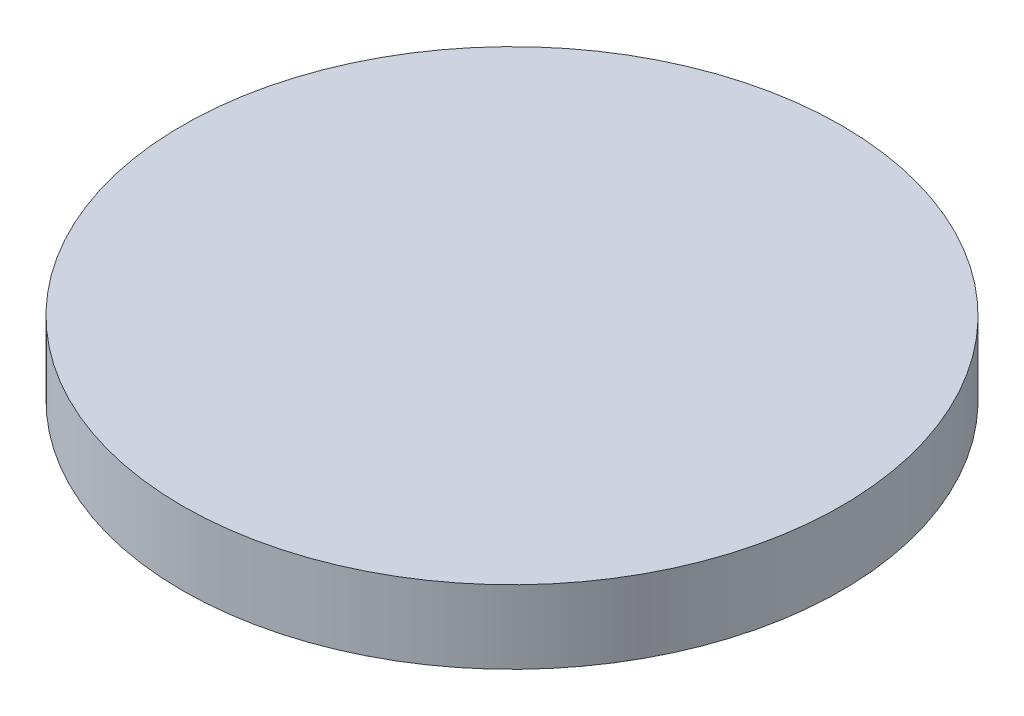
ISO-10303-21;
HEADER;
FILE_DESCRIPTION(('STEP AP214'),'2;1');
FILE_NAME('part.step','',(''),(''),'','','');
FILE_SCHEMA(('AUTOMOTIVE_DESIGN { 1 0 10303 214 1 1 1 1 }'));
ENDSEC;
DATA;
#1=APPLICATION_CONTEXT('core data for automotive mechanical design processes');
#2=APPLICATION_PROTOCOL_DEFINITION('international standard','automotive_design',2000,#1);
#3=PRODUCT_CONTEXT('',#1,'mechanical');
#4=PRODUCT('Part','Part','',(#3));
#5=PRODUCT_RELATED_PRODUCT_CATEGORY('part','',(#4));
#6=PRODUCT_DEFINITION_FORMATION('','',#4);
#7=PRODUCT_DEFINITION_CONTEXT('part definition',#1,'design');
#8=PRODUCT_DEFINITION('design','',#6,#7);
#9=PRODUCT_DEFINITION_SHAPE('','',#8);
#10=(LENGTH_UNIT() NAMED_UNIT(*) SI_UNIT(.MILLI.,.METRE.));
#11=(NAMED_UNIT(*) PLANE_ANGLE_UNIT() SI_UNIT($,.RADIAN.));
#12=(NAMED_UNIT(*) SI_UNIT($,.STERADIAN.) SOLID_ANGLE_UNIT());
#13=UNCERTAINTY_MEASURE_WITH_UNIT(LENGTH_MEASURE(1.E-05),#10,'distance_accuracy_value','');
#14=(GEOMETRIC_REPRESENTATION_CONTEXT(3) GLOBAL_UNCERTAINTY_ASSIGNED_CONTEXT((#13)) GLOBAL_UNIT_ASSIGNED_CONTEXT((#10,
#11,#12)) REPRESENTATION_CONTEXT('',''));
#15=CARTESIAN_POINT('',(0.,0.,0.));
#16=DIRECTION('',(0.,0.,1.));
#17=DIRECTION('',(1.,0.,0.));
#18=AXIS2_PLACEMENT_3D('',#15,#16,#17);
#19=CARTESIAN_POINT('',(0.,19.05,0.));
#20=DIRECTION('',(0.,-1.,0.));
#21=DIRECTION('',(0.,0.,-1.));
#22=AXIS2_PLACEMENT_3D('',#19,#20,#21);
#23=CYLINDRICAL_SURFACE('',#22,85.725);
#24=CARTESIAN_POINT('',(0.,19.05,0.));
#25=DIRECTION('',(0.,1.,0.));
#26=DIRECTION('',(0.,0.,1.));
#27=AXIS2_PLACEMENT_3D('',#24,#25,#26);
#28=CIRCLE('',#27,85.725);
#29=CARTESIAN_POINT('',(0.,19.05,-85.725));
#30=VERTEX_POINT('',#29);
#31=EDGE_CURVE('E10',#30,#30,#28,.T.);
#32=CARTESIAN_POINT('',(0.,0.,0.));
#33=DIRECTION('',(0.,1.,0.));
#34=DIRECTION('',(0.,0.,1.));
#35=AXIS2_PLACEMENT_3D('',#32,#33,#34);
#36=CIRCLE('',#35,85.725);
#37=CARTESIAN_POINT('',(0.,0.,-85.725));
#38=VERTEX_POINT('',#37);
#39=EDGE_CURVE('E35',#38,#38,#36,.T.);
#40=CARTESIAN_POINT('',(0.,19.05,-85.725));
#41=CARTESIAN_POINT('',(0.,18.8515625,-85.725));
#42=CARTESIAN_POINT('',(0.,18.653125,-85.725));
#43=CARTESIAN_POINT('',(0.,18.25625,-85.725));
#44=CARTESIAN_POINT('',(0.,18.0578125,-85.725));
#45=CARTESIAN_POINT('',(0.,17.6609375,-85.725));
#46=CARTESIAN_POINT('',(0.,17.4625,-85.725));
#47=CARTESIAN_POINT('',(0.,17.065625,-85.725));
#48=CARTESIAN_POINT('',(0.,16.8671875,-85.725));
#49=CARTESIAN_POINT('',(0.,16.4703125,-85.725));
#50=CARTESIAN_POINT('',(0.,16.271875,-85.725));
#51=CARTESIAN_POINT('',(0.,15.875,-85.725));
#52=CARTESIAN_POINT('',(0.,15.6765625,-85.725));
#53=CARTESIAN_POINT('',(0.,15.2796875,-85.725));
#54=CARTESIAN_POINT('',(0.,15.08125,-85.725));
#55=CARTESIAN_POINT('',(0.,14.684375,-85.725));
#56=CARTESIAN_POINT('',(0.,14.4859375,-85.725));
#57=CARTESIAN_POINT('',(0.,14.0890625,-85.725));
#58=CARTESIAN_POINT('',(0.,13.890625,-85.725));
#59=CARTESIAN_POINT('',(0.,13.49375,-85.725));
#60=CARTESIAN_POINT('',(0.,13.2953125,-85.725));
#61=CARTESIAN_POINT('',(0.,12.8984375,-85.725));
#62=CARTESIAN_POINT('',(0.,12.7,-85.725));
#63=CARTESIAN_POINT('',(0.,12.303125,-85.725));
#64=CARTESIAN_POINT('',(0.,12.1046875,-85.725));
#65=CARTESIAN_POINT('',(0.,11.7078125,-85.725));
#66=CARTESIAN_POINT('',(0.,11.509375,-85.725));
#67=CARTESIAN_POINT('',(0.,11.1125,-85.725));
#68=CARTESIAN_POINT('',(0.,10.9140625,-85.725));
#69=CARTESIAN_POINT('',(0.,10.5171875,-85.725));
#70=CARTESIAN_POINT('',(0.,10.31875,-85.725));
#71=CARTESIAN_POINT('',(0.,9.921875,-85.725));
#72=CARTESIAN_POINT('',(0.,9.7234375,-85.725));
#73=CARTESIAN_POINT('',(0.,9.3265625,-85.725));
#74=CARTESIAN_POINT('',(0.,9.128125,-85.725));
#75=CARTESIAN_POINT('',(0.,8.73125,-85.725));
#76=CARTESIAN_POINT('',(0.,8.5328125,-85.725));
#77=CARTESIAN_POINT('',(0.,8.1359375,-85.725));
#78=CARTESIAN_POINT('',(0.,7.9375,-85.725));
#79=CARTESIAN_POINT('',(0.,7.540625,-85.725));
#80=CARTESIAN_POINT('',(0.,7.3421875,-85.725));
#81=CARTESIAN_POINT('',(0.,6.9453125,-85.725));
#82=CARTESIAN_POINT('',(0.,6.746875,-85.725));
#83=CARTESIAN_POINT('',(0.,6.35,-85.725));
#84=CARTESIAN_POINT('',(0.,6.1515625,-85.725));
#85=CARTESIAN_POINT('',(0.,5.7546875,-85.725));
#86=CARTESIAN_POINT('',(0.,5.55625,-85.725));
#87=CARTESIAN_POINT('',(0.,5.159375,-85.725));
#88=CARTESIAN_POINT('',(0.,4.9609375,-85.725));
#89=CARTESIAN_POINT('',(0.,4.5640625,-85.725));
#90=CARTESIAN_POINT('',(0.,4.365625,-85.725));
#91=CARTESIAN_POINT('',(0.,3.96875,-85.725));
#92=CARTESIAN_POINT('',(0.,3.7703125,-85.725));
#93=CARTESIAN_POINT('',(0.,3.3734375,-85.725));
#94=CARTESIAN_POINT('',(0.,3.175,-85.725));
#95=CARTESIAN_POINT('',(0.,2.778125,-85.725));
#96=CARTESIAN_POINT('',(0.,2.5796875,-85.725));
#97=CARTESIAN_POINT('',(0.,2.1828125,-85.725));
#98=CARTESIAN_POINT('',(0.,1.984375,-85.725));
#99=CARTESIAN_POINT('',(0.,1.5875,-85.725));
#100=CARTESIAN_POINT('',(0.,1.3890625,-85.725));
#101=CARTESIAN_POINT('',(0.,0.992187500000001,-85.725));
#102=CARTESIAN_POINT('',(0.,0.793750000000001,-85.725));
#103=CARTESIAN_POINT('',(0.,0.396875,-85.725));
#104=CARTESIAN_POINT('',(0.,0.1984375,-85.725));
#105=CARTESIAN_POINT('',(0.,0.,-85.725));
#106=B_SPLINE_CURVE_WITH_KNOTS('',3,(#40,#41,#42,#43,#44,#45,#46,#47,#48,#49,#50,#51,#52,#53,
#54,#55,#56,#57,#58,#59,#60,#61,#62,#63,#64,#65,#66,#67,#68,#69,#70,#71,#72,#73,#74,#75,#76,#77,
#78,#79,#80,#81,#82,#83,#84,#85,#86,#87,#88,#89,#90,#91,#92,#93,#94,#95,#96,#97,#98,#99,#100,
#101,#102,#103,#104,#105),.UNSPECIFIED.,.F.,.F.,(4,2,2,2,2,2,2,2,2,2,2,2,2,2,2,2,2,2,2,2,2,2,2,
2,2,2,2,2,2,2,2,2,4),(0.,0.595312499999997,1.190625,1.7859375,2.38125,2.9765625,3.571875,
4.1671875,4.7625,5.3578125,5.953125,6.5484375,7.14375,7.7390625,8.334375,8.9296875,9.525,
10.1203125,10.715625,11.3109375,11.90625,12.5015625,13.096875,13.6921875,14.2875,14.8828125,
15.478125,16.0734375,16.66875,17.2640625,17.859375,18.4546875,19.05),.UNSPECIFIED.);
#107=EDGE_CURVE('BSEAM32',#30,#38,#106,.T.);
#108=ORIENTED_EDGE('',*,*,#31,.F.);
#109=ORIENTED_EDGE('',*,*,#39,.T.);
#110=ORIENTED_EDGE('',*,*,#107,.T.);
#111=ORIENTED_EDGE('',*,*,#107,.F.);
#112=EDGE_LOOP('',(#108,#110,#109,#111));
#113=FACE_BOUND('',#112,.T.);
#114=ADVANCED_FACE('F32',(#113),#23,.T.);
#115=CARTESIAN_POINT('',(0.,19.05,0.));
#116=DIRECTION('',(0.,1.,0.));
#117=DIRECTION('',(0.,0.,1.));
#118=AXIS2_PLACEMENT_3D('',#115,#116,#117);
#119=PLANE('',#118);
#120=ORIENTED_EDGE('',*,*,#31,.T.);
#121=EDGE_LOOP('',(#120));
#122=FACE_BOUND('',#121,.T.);
#123=ADVANCED_FACE('F53',(#122),#119,.T.);
#124=CARTESIAN_POINT('',(0.,0.,0.));
#125=DIRECTION('',(0.,1.,0.));
#126=DIRECTION('',(0.,0.,1.));
#127=AXIS2_PLACEMENT_3D('',#124,#125,#126);
#128=PLANE('',#127);
#129=ORIENTED_EDGE('',*,*,#39,.F.);
#130=EDGE_LOOP('',(#129));
#131=FACE_BOUND('',#130,.T.);
#132=ADVANCED_FACE('F51',(#131),#128,.F.);
#133=CLOSED_SHELL('',(#114,#123,#132));
#134=MANIFOLD_SOLID_BREP('B2',#133);
#135=ADVANCED_BREP_SHAPE_REPRESENTATION('',(#18,#134),#14);
#136=SHAPE_DEFINITION_REPRESENTATION(#9,#135);
ENDSEC;
END-ISO-10303-21;
